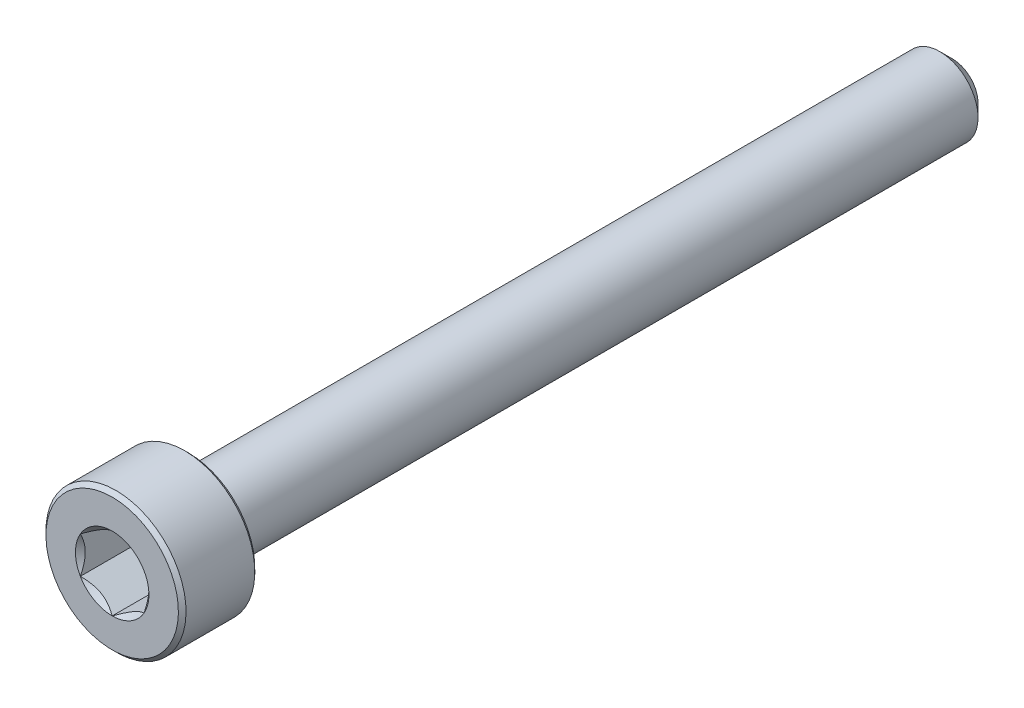
ISO-10303-21;
HEADER;
FILE_DESCRIPTION(('STEP AP214'),'2;1');
FILE_NAME('part.step','',(''),(''),'','','');
FILE_SCHEMA(('AUTOMOTIVE_DESIGN { 1 0 10303 214 1 1 1 1 }'));
ENDSEC;
DATA;
#1=APPLICATION_CONTEXT('core data for automotive mechanical design processes');
#2=APPLICATION_PROTOCOL_DEFINITION('international standard','automotive_design',2000,#1);
#3=PRODUCT_CONTEXT('',#1,'mechanical');
#4=PRODUCT('Part','Part','',(#3));
#5=PRODUCT_RELATED_PRODUCT_CATEGORY('part','',(#4));
#6=PRODUCT_DEFINITION_FORMATION('','',#4);
#7=PRODUCT_DEFINITION_CONTEXT('part definition',#1,'design');
#8=PRODUCT_DEFINITION('design','',#6,#7);
#9=PRODUCT_DEFINITION_SHAPE('','',#8);
#10=(LENGTH_UNIT() NAMED_UNIT(*) SI_UNIT(.MILLI.,.METRE.));
#11=(NAMED_UNIT(*) PLANE_ANGLE_UNIT() SI_UNIT($,.RADIAN.));
#12=(NAMED_UNIT(*) SI_UNIT($,.STERADIAN.) SOLID_ANGLE_UNIT());
#13=UNCERTAINTY_MEASURE_WITH_UNIT(LENGTH_MEASURE(1.E-05),#10,'distance_accuracy_value','');
#14=(GEOMETRIC_REPRESENTATION_CONTEXT(3) GLOBAL_UNCERTAINTY_ASSIGNED_CONTEXT((#13)) GLOBAL_UNIT_ASSIGNED_CONTEXT((#10,
#11,#12)) REPRESENTATION_CONTEXT('',''));
#15=CARTESIAN_POINT('',(0.,0.,0.));
#16=DIRECTION('',(0.,0.,1.));
#17=DIRECTION('',(1.,0.,0.));
#18=AXIS2_PLACEMENT_3D('',#15,#16,#17);
#19=CARTESIAN_POINT('',(0.,0.,16.5));
#20=DIRECTION('',(0.,0.,1.));
#21=DIRECTION('',(0.,-1.,0.));
#22=AXIS2_PLACEMENT_3D('',#19,#20,#21);
#23=PLANE('',#22);
#24=CARTESIAN_POINT('',(0.,0.,16.5));
#25=DIRECTION('',(0.,0.,1.));
#26=DIRECTION('',(1.,0.,0.));
#27=AXIS2_PLACEMENT_3D('',#24,#25,#26);
#28=CIRCLE('',#27,1.44337567297406);
#29=CARTESIAN_POINT('',(0.,-1.44337567297406,16.5));
#30=VERTEX_POINT('',#29);
#31=CARTESIAN_POINT('',(1.25,-0.721687836487031,16.5));
#32=VERTEX_POINT('',#31);
#33=EDGE_CURVE('E101',#30,#32,#28,.T.);
#34=ORIENTED_EDGE('',*,*,#33,.F.);
#35=CARTESIAN_POINT('',(-1.25,-0.721687836487032,16.5));
#36=VERTEX_POINT('',#35);
#37=EDGE_CURVE('E271',#36,#30,#28,.T.);
#38=ORIENTED_EDGE('',*,*,#37,.F.);
#39=CARTESIAN_POINT('',(-1.25,0.721687836487033,16.5));
#40=VERTEX_POINT('',#39);
#41=EDGE_CURVE('E136',#40,#36,#28,.T.);
#42=ORIENTED_EDGE('',*,*,#41,.F.);
#43=CARTESIAN_POINT('',(0.,1.44337567297406,16.5));
#44=VERTEX_POINT('',#43);
#45=EDGE_CURVE('E132',#44,#40,#28,.T.);
#46=ORIENTED_EDGE('',*,*,#45,.F.);
#47=CARTESIAN_POINT('',(1.25,0.721687836487033,16.5));
#48=VERTEX_POINT('',#47);
#49=EDGE_CURVE('E103',#48,#44,#28,.T.);
#50=ORIENTED_EDGE('',*,*,#49,.F.);
#51=EDGE_CURVE('E95',#32,#48,#28,.T.);
#52=ORIENTED_EDGE('',*,*,#51,.F.);
#53=EDGE_LOOP('',(#34,#38,#42,#46,#50,#52));
#54=FACE_BOUND('',#53,.T.);
#55=CARTESIAN_POINT('',(0.,0.,16.5));
#56=DIRECTION('',(0.,0.,-1.));
#57=DIRECTION('',(0.,1.,0.));
#58=AXIS2_PLACEMENT_3D('',#55,#56,#57);
#59=CIRCLE('',#58,2.6);
#60=CARTESIAN_POINT('',(0.,2.6,16.5));
#61=VERTEX_POINT('',#60);
#62=EDGE_CURVE('E51',#61,#61,#59,.T.);
#63=ORIENTED_EDGE('',*,*,#62,.F.);
#64=EDGE_LOOP('',(#63));
#65=FACE_BOUND('',#64,.T.);
#66=ADVANCED_FACE('F38',(#54,#65),#23,.T.);
#67=CARTESIAN_POINT('',(0.,0.,16.35));
#68=DIRECTION('',(0.,0.,-1.));
#69=DIRECTION('',(0.,1.,0.));
#70=AXIS2_PLACEMENT_3D('',#67,#68,#69);
#71=CONICAL_SURFACE('',#70,2.75,0.785398163397434);
#72=ORIENTED_EDGE('',*,*,#62,.T.);
#73=EDGE_LOOP('',(#72));
#74=FACE_BOUND('',#73,.T.);
#75=CARTESIAN_POINT('',(0.,0.,16.35));
#76=DIRECTION('',(0.,0.,-1.));
#77=DIRECTION('',(0.,1.,0.));
#78=AXIS2_PLACEMENT_3D('',#75,#76,#77);
#79=CIRCLE('',#78,2.75);
#80=CARTESIAN_POINT('',(0.,2.75,16.35));
#81=VERTEX_POINT('',#80);
#82=EDGE_CURVE('E222',#81,#81,#79,.T.);
#83=ORIENTED_EDGE('',*,*,#82,.F.);
#84=EDGE_LOOP('',(#83));
#85=FACE_BOUND('',#84,.T.);
#86=ADVANCED_FACE('F210',(#74,#85),#71,.T.);
#87=CARTESIAN_POINT('',(0.,0.,-16.5));
#88=DIRECTION('',(0.,0.,-1.));
#89=DIRECTION('',(0.,1.,0.));
#90=AXIS2_PLACEMENT_3D('',#87,#88,#89);
#91=CYLINDRICAL_SURFACE('',#90,2.75);
#92=ORIENTED_EDGE('',*,*,#82,.T.);
#93=EDGE_LOOP('',(#92));
#94=FACE_BOUND('',#93,.T.);
#95=CARTESIAN_POINT('',(0.,0.,13.65));
#96=DIRECTION('',(0.,0.,-1.));
#97=DIRECTION('',(0.,1.,0.));
#98=AXIS2_PLACEMENT_3D('',#95,#96,#97);
#99=CIRCLE('',#98,2.75);
#100=CARTESIAN_POINT('',(0.,2.75,13.65));
#101=VERTEX_POINT('',#100);
#102=EDGE_CURVE('E223',#101,#101,#99,.T.);
#103=ORIENTED_EDGE('',*,*,#102,.F.);
#104=EDGE_LOOP('',(#103));
#105=FACE_BOUND('',#104,.T.);
#106=ADVANCED_FACE('F207',(#94,#105),#91,.T.);
#107=CARTESIAN_POINT('',(0.,0.,13.5));
#108=DIRECTION('',(0.,0.,1.));
#109=DIRECTION('',(0.,-1.,0.));
#110=AXIS2_PLACEMENT_3D('',#107,#108,#109);
#111=CONICAL_SURFACE('',#110,2.6,0.785398163397445);
#112=ORIENTED_EDGE('',*,*,#102,.T.);
#113=EDGE_LOOP('',(#112));
#114=FACE_BOUND('',#113,.T.);
#115=CARTESIAN_POINT('',(0.,0.,13.5));
#116=DIRECTION('',(0.,0.,-1.));
#117=DIRECTION('',(0.,1.,0.));
#118=AXIS2_PLACEMENT_3D('',#115,#116,#117);
#119=CIRCLE('',#118,2.6);
#120=CARTESIAN_POINT('',(0.,2.6,13.5));
#121=VERTEX_POINT('',#120);
#122=EDGE_CURVE('E226',#121,#121,#119,.T.);
#123=ORIENTED_EDGE('',*,*,#122,.F.);
#124=EDGE_LOOP('',(#123));
#125=FACE_BOUND('',#124,.T.);
#126=ADVANCED_FACE('F203',(#114,#125),#111,.T.);
#127=CARTESIAN_POINT('',(0.,2.6,13.5));
#128=DIRECTION('',(0.,0.,-1.));
#129=DIRECTION('',(0.,1.,0.));
#130=AXIS2_PLACEMENT_3D('',#127,#128,#129);
#131=PLANE('',#130);
#132=ORIENTED_EDGE('',*,*,#122,.T.);
#133=EDGE_LOOP('',(#132));
#134=FACE_BOUND('',#133,.T.);
#135=CARTESIAN_POINT('',(0.,0.,13.5));
#136=DIRECTION('',(0.,0.,-1.));
#137=DIRECTION('',(0.,1.,0.));
#138=AXIS2_PLACEMENT_3D('',#135,#136,#137);
#139=CIRCLE('',#138,1.5);
#140=CARTESIAN_POINT('',(0.,1.5,13.5));
#141=VERTEX_POINT('',#140);
#142=EDGE_CURVE('E231',#141,#141,#139,.T.);
#143=ORIENTED_EDGE('',*,*,#142,.F.);
#144=EDGE_LOOP('',(#143));
#145=FACE_BOUND('',#144,.T.);
#146=ADVANCED_FACE('F199',(#134,#145),#131,.T.);
#147=CARTESIAN_POINT('',(0.,0.,-16.5));
#148=DIRECTION('',(0.,0.,-1.));
#149=DIRECTION('',(0.,1.,0.));
#150=AXIS2_PLACEMENT_3D('',#147,#148,#149);
#151=CYLINDRICAL_SURFACE('',#150,1.5);
#152=ORIENTED_EDGE('',*,*,#142,.T.);
#153=EDGE_LOOP('',(#152));
#154=FACE_BOUND('',#153,.T.);
#155=CARTESIAN_POINT('',(0.,0.,-16.));
#156=DIRECTION('',(0.,0.,-1.));
#157=DIRECTION('',(0.,1.,0.));
#158=AXIS2_PLACEMENT_3D('',#155,#156,#157);
#159=CIRCLE('',#158,1.5);
#160=CARTESIAN_POINT('',(0.,1.5,-16.));
#161=VERTEX_POINT('',#160);
#162=EDGE_CURVE('E234',#161,#161,#159,.T.);
#163=ORIENTED_EDGE('',*,*,#162,.F.);
#164=EDGE_LOOP('',(#163));
#165=FACE_BOUND('',#164,.T.);
#166=ADVANCED_FACE('F195',(#154,#165),#151,.T.);
#167=CARTESIAN_POINT('',(0.,0.,-16.5));
#168=DIRECTION('',(0.,0.,1.));
#169=DIRECTION('',(0.,-1.,0.));
#170=AXIS2_PLACEMENT_3D('',#167,#168,#169);
#171=CONICAL_SURFACE('',#170,1.,0.785398163397441);
#172=ORIENTED_EDGE('',*,*,#162,.T.);
#173=EDGE_LOOP('',(#172));
#174=FACE_BOUND('',#173,.T.);
#175=CARTESIAN_POINT('',(0.,0.,-16.5));
#176=DIRECTION('',(0.,0.,-1.));
#177=DIRECTION('',(0.,1.,0.));
#178=AXIS2_PLACEMENT_3D('',#175,#176,#177);
#179=CIRCLE('',#178,1.);
#180=CARTESIAN_POINT('',(0.,1.,-16.5));
#181=VERTEX_POINT('',#180);
#182=EDGE_CURVE('E237',#181,#181,#179,.T.);
#183=ORIENTED_EDGE('',*,*,#182,.F.);
#184=EDGE_LOOP('',(#183));
#185=FACE_BOUND('',#184,.T.);
#186=ADVANCED_FACE('F191',(#174,#185),#171,.T.);
#187=CARTESIAN_POINT('',(0.,1.,-16.5));
#188=DIRECTION('',(0.,0.,-1.));
#189=DIRECTION('',(0.,1.,0.));
#190=AXIS2_PLACEMENT_3D('',#187,#188,#189);
#191=PLANE('',#190);
#192=ORIENTED_EDGE('',*,*,#182,.T.);
#193=EDGE_LOOP('',(#192));
#194=FACE_BOUND('',#193,.T.);
#195=ADVANCED_FACE('F188',(#194),#191,.T.);
#196=CARTESIAN_POINT('',(0.,0.,16.5));
#197=DIRECTION('',(0.,0.,1.));
#198=DIRECTION('',(1.,0.,0.));
#199=AXIS2_PLACEMENT_3D('',#196,#197,#198);
#200=CONICAL_SURFACE('',#199,1.44337567297406,0.78539816339745);
#201=ORIENTED_EDGE('',*,*,#33,.T.);
#202=CARTESIAN_POINT('',(-0.000200000000000081,-1.4434911430279,16.5001154839091));
#203=CARTESIAN_POINT('',(0.0427751670715865,-1.41867941875065,16.4753216680551));
#204=CARTESIAN_POINT('',(0.0864690047459475,-1.39345276980743,16.4519837344187));
#205=CARTESIAN_POINT('',(0.175565930841941,-1.34201263554194,16.4092520040845));
#206=CARTESIAN_POINT('',(0.220977498357063,-1.31579425481276,16.3898819923604));
#207=CARTESIAN_POINT('',(0.312547820935259,-1.26292610442246,16.3567004834135));
#208=CARTESIAN_POINT('',(0.358683240175884,-1.23628980770471,16.3428055590527));
#209=CARTESIAN_POINT('',(0.45197008040759,-1.18243062538508,16.3213972821606));
#210=CARTESIAN_POINT('',(0.499118649136377,-1.15520938653761,16.3138679415668));
#211=CARTESIAN_POINT('',(0.580373556887249,-1.10829684367467,16.3070744980507));
#212=CARTESIAN_POINT('',(0.614374876627938,-1.08866617256958,16.3060685591044));
#213=CARTESIAN_POINT('',(0.682317764432474,-1.04943932800611,16.3077614149113));
#214=CARTESIAN_POINT('',(0.716259317655654,-1.02984316311599,16.3104610272155));
#215=CARTESIAN_POINT('',(0.783814856457496,-0.990839954603501,16.3194089303164));
#216=CARTESIAN_POINT('',(0.817428507286772,-0.971433104248772,16.3256605258997));
#217=CARTESIAN_POINT('',(0.88409463821781,-0.932943395609907,16.3413756814139));
#218=CARTESIAN_POINT('',(0.917146871030292,-0.913860680098302,16.3508406200875));
#219=CARTESIAN_POINT('',(1.00179969160026,-0.864986351354569,16.3789313906876));
#220=CARTESIAN_POINT('',(1.05286649242963,-0.835502920149077,16.3996701574522));
#221=CARTESIAN_POINT('',(1.15300085411325,-0.777690319475909,16.4463871346715));
#222=CARTESIAN_POINT('',(1.20207431157827,-0.749357745598417,16.4723482959468));
#223=CARTESIAN_POINT('',(1.2502,-0.721572366433194,16.5001154839091));
#224=B_SPLINE_CURVE_WITH_KNOTS('',3,(#202,#203,#204,#205,#206,#207,#208,#209,#210,#211,#212,
#213,#214,#215,#216,#217,#218,#219,#220,#221,#222,#223),.UNSPECIFIED.,.F.,.F.,(4,2,2,2,2,2,2,2,
2,2,4),(0.,0.166533409618303,0.334037607289762,0.498880396489697,0.663307919240272,
0.780963963458824,0.89864597014845,1.01643764860773,1.13427993171549,1.3214865203214,
1.50809158792573),.UNSPECIFIED.);
#225=EDGE_CURVE('E12',#30,#32,#224,.T.);
#226=ORIENTED_EDGE('',*,*,#225,.F.);
#227=EDGE_LOOP('',(#201,#226));
#228=FACE_BOUND('',#227,.T.);
#229=ADVANCED_FACE('F154',(#228),#200,.F.);
#230=ORIENTED_EDGE('',*,*,#37,.T.);
#231=CARTESIAN_POINT('',(-1.2502,-0.721572366433194,16.5001154839091));
#232=CARTESIAN_POINT('',(-1.20722483292841,-0.746384090710444,16.4753216680551));
#233=CARTESIAN_POINT('',(-1.16353099525405,-0.771610739653664,16.4519837344187));
#234=CARTESIAN_POINT('',(-1.07443406915806,-0.823050873919153,16.4092520040845));
#235=CARTESIAN_POINT('',(-1.02902250164294,-0.849269254648332,16.3898819923604));
#236=CARTESIAN_POINT('',(-0.937452179064743,-0.902137405038634,16.3567004834135));
#237=CARTESIAN_POINT('',(-0.891316759824117,-0.928773701756385,16.3428055590527));
#238=CARTESIAN_POINT('',(-0.79802991959241,-0.982632884076011,16.3213972821606));
#239=CARTESIAN_POINT('',(-0.750881350863623,-1.00985412292348,16.3138679415668));
#240=CARTESIAN_POINT('',(-0.669626443112751,-1.05676666578643,16.3070744980507));
#241=CARTESIAN_POINT('',(-0.635625123372062,-1.07639733689151,16.3060685591044));
#242=CARTESIAN_POINT('',(-0.567682235567526,-1.11562418145498,16.3077614149113));
#243=CARTESIAN_POINT('',(-0.533740682344346,-1.1352203463451,16.3104610272155));
#244=CARTESIAN_POINT('',(-0.466185143542504,-1.1742235548576,16.3194089303164));
#245=CARTESIAN_POINT('',(-0.432571492713229,-1.19363040521232,16.3256605258997));
#246=CARTESIAN_POINT('',(-0.365905361782191,-1.23212011385119,16.3413756814139));
#247=CARTESIAN_POINT('',(-0.332853128969708,-1.25120282936279,16.3508406200875));
#248=CARTESIAN_POINT('',(-0.248200308399738,-1.30007715810653,16.3789313906876));
#249=CARTESIAN_POINT('',(-0.197133507570364,-1.32956058931202,16.3996701574522));
#250=CARTESIAN_POINT('',(-0.0969991458867461,-1.38737318998519,16.4463871346715));
#251=CARTESIAN_POINT('',(-0.0479256884217307,-1.41570576386268,16.4723482959468));
#252=CARTESIAN_POINT('',(0.000200000000001012,-1.4434911430279,16.5001154839091));
#253=B_SPLINE_CURVE_WITH_KNOTS('',3,(#231,#232,#233,#234,#235,#236,#237,#238,#239,#240,#241,
#242,#243,#244,#245,#246,#247,#248,#249,#250,#251,#252),.UNSPECIFIED.,.F.,.F.,(4,2,2,2,2,2,2,2,
2,2,4),(0.,0.166533409618302,0.334037607289759,0.498880396489696,0.663307919240271,
0.780963963458824,0.898645970148449,1.01643764860773,1.13427993171549,1.32148652032141,
1.50809158792574),.UNSPECIFIED.);
#254=EDGE_CURVE('E133',#36,#30,#253,.T.);
#255=ORIENTED_EDGE('',*,*,#254,.F.);
#256=EDGE_LOOP('',(#230,#255));
#257=FACE_BOUND('',#256,.T.);
#258=ADVANCED_FACE('F269',(#257),#200,.F.);
#259=ORIENTED_EDGE('',*,*,#41,.T.);
#260=CARTESIAN_POINT('',(-1.25,-1.43934010808077,16.9629820968923));
#261=CARTESIAN_POINT('',(-1.25,-1.40429313005659,16.9365249226329));
#262=CARTESIAN_POINT('',(-1.25,-1.36905087135599,16.9103271603543));
#263=CARTESIAN_POINT('',(-1.25,-1.29809650706311,16.8585575718396));
#264=CARTESIAN_POINT('',(-1.25,-1.26238428576496,16.8329859043563));
#265=CARTESIAN_POINT('',(-1.25,-1.15390111792708,16.7570059936895));
#266=CARTESIAN_POINT('',(-1.25,-1.08031646726265,16.7077402861896));
#267=CARTESIAN_POINT('',(-1.25,-0.926012322755098,16.6110258302631));
#268=CARTESIAN_POINT('',(-1.25,-0.845125318656149,16.5638412989418));
#269=CARTESIAN_POINT('',(-1.25,-0.679311174076605,16.4775307343904));
#270=CARTESIAN_POINT('',(-1.25,-0.594398891026689,16.4383775346269));
#271=CARTESIAN_POINT('',(-1.25,-0.466944812460742,16.3904772236883));
#272=CARTESIAN_POINT('',(-1.25,-0.426289985812823,16.3767294897863));
#273=CARTESIAN_POINT('',(-1.25,-0.343998850091269,16.3524979274505));
#274=CARTESIAN_POINT('',(-1.25,-0.302362473614963,16.3420143238698));
#275=CARTESIAN_POINT('',(-1.25,-0.219052696285666,16.3250301617483));
#276=CARTESIAN_POINT('',(-1.25,-0.1773934284745,16.3184613604714));
#277=CARTESIAN_POINT('',(-1.25,-0.0936293693401925,16.3094350534578));
#278=CARTESIAN_POINT('',(-1.25,-0.0515246558543964,16.3069768409973));
#279=CARTESIAN_POINT('',(-1.25,0.0311890576306315,16.3063540620133));
#280=CARTESIAN_POINT('',(-1.25,0.0717969625499306,16.3080371168463));
#281=CARTESIAN_POINT('',(-1.25,0.152668636885198,16.3152682705979));
#282=CARTESIAN_POINT('',(-1.25,0.192932338835359,16.3208171104131));
#283=CARTESIAN_POINT('',(-1.25,0.273499879165296,16.335571036465));
#284=CARTESIAN_POINT('',(-1.25,0.313792180618512,16.3448381759641));
#285=CARTESIAN_POINT('',(-1.25,0.393496413911458,16.3665361784573));
#286=CARTESIAN_POINT('',(-1.25,0.432908419115059,16.3789667767306));
#287=CARTESIAN_POINT('',(-1.25,0.556992735862299,16.4227793529314));
#288=CARTESIAN_POINT('',(-1.25,0.639898924666086,16.459151072876));
#289=CARTESIAN_POINT('',(-1.25,0.801816555499701,16.5400191621783));
#290=CARTESIAN_POINT('',(-1.25,0.880812666325045,16.584544720912));
#291=CARTESIAN_POINT('',(-1.25,1.0317856127975,16.6764048766666));
#292=CARTESIAN_POINT('',(-1.25,1.10391618485086,16.7234899339163));
#293=CARTESIAN_POINT('',(-1.25,1.2101860604331,16.7962785615985));
#294=CARTESIAN_POINT('',(-1.25,1.24515069969379,16.8207980853934));
#295=CARTESIAN_POINT('',(-1.25,1.31460220852736,16.8704856367657));
#296=CARTESIAN_POINT('',(-1.25,1.34908920596618,16.8956534854155));
#297=CARTESIAN_POINT('',(-1.25,1.38337731682912,16.9210901488412));
#298=B_SPLINE_CURVE_WITH_KNOTS('',3,(#260,#261,#262,#263,#264,#265,#266,#267,#268,#269,#270,
#271,#272,#273,#274,#275,#276,#277,#278,#279,#280,#281,#282,#283,#284,#285,#286,#287,#288,#289,
#290,#291,#292,#293,#294,#295,#296,#297),.UNSPECIFIED.,.F.,.F.,(4,2,2,2,2,2,2,2,2,2,2,2,2,2,2,2,
2,2,4),(0.,0.131732960381449,0.263498984161644,0.529042014455825,0.809741926134618,
1.08947609717225,1.21811634272577,1.34676544783901,1.47310084517844,1.59941451973785,
1.7211504216785,1.84290966131735,1.96679153905342,2.09066305366039,2.36146692896009,
2.63325989198491,2.89154668212279,3.01965734507713,3.14773302245628),.UNSPECIFIED.);
#299=EDGE_CURVE('E134',#40,#36,#298,.F.);
#300=ORIENTED_EDGE('',*,*,#299,.F.);
#301=EDGE_LOOP('',(#259,#300));
#302=FACE_BOUND('',#301,.T.);
#303=ADVANCED_FACE('F274',(#302),#200,.F.);
#304=ORIENTED_EDGE('',*,*,#45,.T.);
#305=CARTESIAN_POINT('',(0.000199999999999872,1.4434911430279,16.5001154839091));
#306=CARTESIAN_POINT('',(-0.0427751670715865,1.41867941875065,16.4753216680551));
#307=CARTESIAN_POINT('',(-0.0864690047459473,1.39345276980743,16.4519837344187));
#308=CARTESIAN_POINT('',(-0.17556593084194,1.34201263554194,16.4092520040845));
#309=CARTESIAN_POINT('',(-0.220977498357062,1.31579425481276,16.3898819923604));
#310=CARTESIAN_POINT('',(-0.312547820935258,1.26292610442246,16.3567004834135));
#311=CARTESIAN_POINT('',(-0.358683240175883,1.23628980770471,16.3428055590527));
#312=CARTESIAN_POINT('',(-0.45197008040759,1.18243062538509,16.3213972821606));
#313=CARTESIAN_POINT('',(-0.499118649136377,1.15520938653761,16.3138679415668));
#314=CARTESIAN_POINT('',(-0.58037355688725,1.10829684367467,16.3070744980507));
#315=CARTESIAN_POINT('',(-0.614374876627938,1.08866617256958,16.3060685591044));
#316=CARTESIAN_POINT('',(-0.682317764432475,1.04943932800611,16.3077614149113));
#317=CARTESIAN_POINT('',(-0.716259317655655,1.02984316311599,16.3104610272155));
#318=CARTESIAN_POINT('',(-0.783814856457497,0.9908399546035,16.3194089303164));
#319=CARTESIAN_POINT('',(-0.817428507286773,0.971433104248772,16.3256605258997));
#320=CARTESIAN_POINT('',(-0.884094638217811,0.932943395609906,16.3413756814139));
#321=CARTESIAN_POINT('',(-0.917146871030293,0.913860680098302,16.3508406200875));
#322=CARTESIAN_POINT('',(-1.00179969160026,0.864986351354569,16.3789313906876));
#323=CARTESIAN_POINT('',(-1.05286649242964,0.835502920149077,16.3996701574522));
#324=CARTESIAN_POINT('',(-1.15300085411325,0.777690319475909,16.4463871346715));
#325=CARTESIAN_POINT('',(-1.20207431157827,0.749357745598417,16.4723482959468));
#326=CARTESIAN_POINT('',(-1.2502,0.721572366433194,16.5001154839091));
#327=B_SPLINE_CURVE_WITH_KNOTS('',3,(#305,#306,#307,#308,#309,#310,#311,#312,#313,#314,#315,
#316,#317,#318,#319,#320,#321,#322,#323,#324,#325,#326),.UNSPECIFIED.,.F.,.F.,(4,2,2,2,2,2,2,2,
2,2,4),(0.,0.166533409618302,0.33403760728976,0.498880396489696,0.663307919240272,
0.780963963458824,0.89864597014845,1.01643764860773,1.13427993171549,1.32148652032141,
1.50809158792574),.UNSPECIFIED.);
#328=EDGE_CURVE('E113',#44,#40,#327,.T.);
#329=ORIENTED_EDGE('',*,*,#328,.F.);
#330=EDGE_LOOP('',(#304,#329));
#331=FACE_BOUND('',#330,.T.);
#332=ADVANCED_FACE('F308',(#331),#200,.F.);
#333=ORIENTED_EDGE('',*,*,#49,.T.);
#334=CARTESIAN_POINT('',(1.2502,0.721572366433195,16.5001154839091));
#335=CARTESIAN_POINT('',(1.20722483292841,0.746384090710444,16.4753216680551));
#336=CARTESIAN_POINT('',(1.16353099525405,0.771610739653664,16.4519837344187));
#337=CARTESIAN_POINT('',(1.07443406915806,0.823050873919154,16.4092520040845));
#338=CARTESIAN_POINT('',(1.02902250164294,0.849269254648332,16.3898819923604));
#339=CARTESIAN_POINT('',(0.937452179064743,0.902137405038634,16.3567004834135));
#340=CARTESIAN_POINT('',(0.891316759824118,0.928773701756385,16.3428055590527));
#341=CARTESIAN_POINT('',(0.798029919592411,0.982632884076011,16.3213972821606));
#342=CARTESIAN_POINT('',(0.750881350863624,1.00985412292348,16.3138679415668));
#343=CARTESIAN_POINT('',(0.669626443112752,1.05676666578643,16.3070744980507));
#344=CARTESIAN_POINT('',(0.635625123372064,1.07639733689151,16.3060685591044));
#345=CARTESIAN_POINT('',(0.567682235567527,1.11562418145498,16.3077614149113));
#346=CARTESIAN_POINT('',(0.533740682344347,1.1352203463451,16.3104610272155));
#347=CARTESIAN_POINT('',(0.466185143542505,1.17422355485759,16.3194089303164));
#348=CARTESIAN_POINT('',(0.43257149271323,1.19363040521232,16.3256605258997));
#349=CARTESIAN_POINT('',(0.365905361782192,1.23212011385119,16.3413756814139));
#350=CARTESIAN_POINT('',(0.332853128969709,1.25120282936279,16.3508406200875));
#351=CARTESIAN_POINT('',(0.248200308399739,1.30007715810653,16.3789313906876));
#352=CARTESIAN_POINT('',(0.197133507570365,1.32956058931202,16.3996701574522));
#353=CARTESIAN_POINT('',(0.0969991458867464,1.38737318998519,16.4463871346715));
#354=CARTESIAN_POINT('',(0.0479256884217309,1.41570576386268,16.4723482959468));
#355=CARTESIAN_POINT('',(-0.000200000000001121,1.4434911430279,16.5001154839091));
#356=B_SPLINE_CURVE_WITH_KNOTS('',3,(#334,#335,#336,#337,#338,#339,#340,#341,#342,#343,#344,
#345,#346,#347,#348,#349,#350,#351,#352,#353,#354,#355),.UNSPECIFIED.,.F.,.F.,(4,2,2,2,2,2,2,2,
2,2,4),(0.,0.166533409618302,0.334037607289759,0.498880396489694,0.66330791924027,
0.780963963458821,0.898645970148448,1.01643764860773,1.13427993171549,1.32148652032141,
1.50809158792574),.UNSPECIFIED.);
#357=EDGE_CURVE('E106',#48,#44,#356,.T.);
#358=ORIENTED_EDGE('',*,*,#357,.F.);
#359=EDGE_LOOP('',(#333,#358));
#360=FACE_BOUND('',#359,.T.);
#361=ADVANCED_FACE('F107',(#360),#200,.F.);
#362=ORIENTED_EDGE('',*,*,#51,.T.);
#363=CARTESIAN_POINT('',(1.25,-1.43934010808077,16.9629820968923));
#364=CARTESIAN_POINT('',(1.25,-1.40429313005658,16.9365249226329));
#365=CARTESIAN_POINT('',(1.25,-1.36905087135599,16.9103271603543));
#366=CARTESIAN_POINT('',(1.25,-1.29809650706311,16.8585575718396));
#367=CARTESIAN_POINT('',(1.25,-1.26238428576495,16.8329859043563));
#368=CARTESIAN_POINT('',(1.25,-1.15390111792708,16.7570059936895));
#369=CARTESIAN_POINT('',(1.25,-1.08031646726264,16.7077402861896));
#370=CARTESIAN_POINT('',(1.25,-0.926012322755093,16.6110258302631));
#371=CARTESIAN_POINT('',(1.25,-0.845125318656144,16.5638412989418));
#372=CARTESIAN_POINT('',(1.25,-0.6793111740766,16.4775307343904));
#373=CARTESIAN_POINT('',(1.25,-0.594398891026686,16.4383775346269));
#374=CARTESIAN_POINT('',(1.25,-0.466944812460738,16.3904772236883));
#375=CARTESIAN_POINT('',(1.25,-0.426289985812819,16.3767294897863));
#376=CARTESIAN_POINT('',(1.25,-0.343998850091265,16.3524979274505));
#377=CARTESIAN_POINT('',(1.25,-0.30236247361496,16.3420143238698));
#378=CARTESIAN_POINT('',(1.25,-0.219052696285664,16.3250301617483));
#379=CARTESIAN_POINT('',(1.25,-0.177393428474498,16.3184613604714));
#380=CARTESIAN_POINT('',(1.25,-0.0936293693401904,16.3094350534578));
#381=CARTESIAN_POINT('',(1.25,-0.0515246558543945,16.3069768409973));
#382=CARTESIAN_POINT('',(1.25,0.0311890576306332,16.3063540620133));
#383=CARTESIAN_POINT('',(1.25,0.0717969625499323,16.3080371168463));
#384=CARTESIAN_POINT('',(1.25,0.152668636885199,16.3152682705979));
#385=CARTESIAN_POINT('',(1.25,0.19293233883536,16.3208171104131));
#386=CARTESIAN_POINT('',(1.25,0.273499879165297,16.335571036465));
#387=CARTESIAN_POINT('',(1.25,0.313792180618513,16.3448381759641));
#388=CARTESIAN_POINT('',(1.25,0.393496413911459,16.3665361784573));
#389=CARTESIAN_POINT('',(1.25,0.43290841911506,16.3789667767306));
#390=CARTESIAN_POINT('',(1.25,0.5569927358623,16.4227793529314));
#391=CARTESIAN_POINT('',(1.25,0.639898924666087,16.459151072876));
#392=CARTESIAN_POINT('',(1.25,0.801816555499704,16.5400191621783));
#393=CARTESIAN_POINT('',(1.25,0.880812666325047,16.584544720912));
#394=CARTESIAN_POINT('',(1.25,1.0317856127975,16.6764048766666));
#395=CARTESIAN_POINT('',(1.25,1.10391618485086,16.7234899339163));
#396=CARTESIAN_POINT('',(1.25,1.21018606043311,16.7962785615985));
#397=CARTESIAN_POINT('',(1.25,1.2451506996938,16.8207980853934));
#398=CARTESIAN_POINT('',(1.25,1.31460220852737,16.8704856367657));
#399=CARTESIAN_POINT('',(1.25,1.34908920596618,16.8956534854155));
#400=CARTESIAN_POINT('',(1.25,1.38337731682912,16.9210901488412));
#401=B_SPLINE_CURVE_WITH_KNOTS('',3,(#363,#364,#365,#366,#367,#368,#369,#370,#371,#372,#373,
#374,#375,#376,#377,#378,#379,#380,#381,#382,#383,#384,#385,#386,#387,#388,#389,#390,#391,#392,
#393,#394,#395,#396,#397,#398,#399,#400),.UNSPECIFIED.,.F.,.F.,(4,2,2,2,2,2,2,2,2,2,2,2,2,2,2,2,
2,2,4),(0.,0.131732960381447,0.263498984161644,0.529042014455823,0.809741926134617,
1.08947609717225,1.21811634272576,1.346765447839,1.47310084517844,1.59941451973784,
1.72115042167849,1.84290966131735,1.96679153905341,2.09066305366039,2.36146692896009,
2.63325989198491,2.89154668212279,3.01965734507713,3.14773302245628),.UNSPECIFIED.);
#402=EDGE_CURVE('E57',#32,#48,#401,.T.);
#403=ORIENTED_EDGE('',*,*,#402,.F.);
#404=EDGE_LOOP('',(#362,#403));
#405=FACE_BOUND('',#404,.T.);
#406=ADVANCED_FACE('F97',(#405),#200,.F.);
#407=CARTESIAN_POINT('',(0.,2.6,14.5));
#408=DIRECTION('',(0.,0.,-1.));
#409=DIRECTION('',(0.,1.,0.));
#410=AXIS2_PLACEMENT_3D('',#407,#408,#409);
#411=PLANE('',#410);
#412=DIRECTION('',(0.866025403784438,0.5,0.));
#413=VECTOR('',#412,1.);
#414=CARTESIAN_POINT('',(0.,-1.44337567297406,14.5));
#415=LINE('',#414,#413);
#416=CARTESIAN_POINT('',(0.,-1.44337567297406,14.5));
#417=VERTEX_POINT('',#416);
#418=CARTESIAN_POINT('',(1.25,-0.721687836487032,14.5));
#419=VERTEX_POINT('',#418);
#420=EDGE_CURVE('E240',#417,#419,#415,.T.);
#421=ORIENTED_EDGE('',*,*,#420,.T.);
#422=DIRECTION('',(0.,1.,0.));
#423=VECTOR('',#422,1.);
#424=CARTESIAN_POINT('',(1.25,-0.721687836487032,14.5));
#425=LINE('',#424,#423);
#426=CARTESIAN_POINT('',(1.25,0.721687836487032,14.5));
#427=VERTEX_POINT('',#426);
#428=EDGE_CURVE('E123',#419,#427,#425,.T.);
#429=ORIENTED_EDGE('',*,*,#428,.T.);
#430=DIRECTION('',(-0.866025403784439,0.5,0.));
#431=VECTOR('',#430,1.);
#432=CARTESIAN_POINT('',(1.25,0.721687836487032,14.5));
#433=LINE('',#432,#431);
#434=CARTESIAN_POINT('',(0.,1.44337567297406,14.5));
#435=VERTEX_POINT('',#434);
#436=EDGE_CURVE('E127',#427,#435,#433,.T.);
#437=ORIENTED_EDGE('',*,*,#436,.T.);
#438=DIRECTION('',(-0.866025403784438,-0.5,0.));
#439=VECTOR('',#438,1.);
#440=CARTESIAN_POINT('',(0.,1.44337567297406,14.5));
#441=LINE('',#440,#439);
#442=CARTESIAN_POINT('',(-1.25,0.721687836487032,14.5));
#443=VERTEX_POINT('',#442);
#444=EDGE_CURVE('E244',#435,#443,#441,.T.);
#445=ORIENTED_EDGE('',*,*,#444,.T.);
#446=DIRECTION('',(0.,-1.,0.));
#447=VECTOR('',#446,1.);
#448=CARTESIAN_POINT('',(-1.25,0.721687836487032,14.5));
#449=LINE('',#448,#447);
#450=CARTESIAN_POINT('',(-1.25,-0.721687836487032,14.5));
#451=VERTEX_POINT('',#450);
#452=EDGE_CURVE('E248',#443,#451,#449,.T.);
#453=ORIENTED_EDGE('',*,*,#452,.T.);
#454=DIRECTION('',(0.866025403784439,-0.5,0.));
#455=VECTOR('',#454,1.);
#456=CARTESIAN_POINT('',(-1.25,-0.721687836487032,14.5));
#457=LINE('',#456,#455);
#458=EDGE_CURVE('E250',#451,#417,#457,.T.);
#459=ORIENTED_EDGE('',*,*,#458,.T.);
#460=EDGE_LOOP('',(#421,#429,#437,#445,#453,#459));
#461=FACE_BOUND('',#460,.T.);
#462=ADVANCED_FACE('F153',(#461),#411,.F.);
#463=CARTESIAN_POINT('',(0.,-1.44337567297406,9.68118692087013));
#464=DIRECTION('',(0.5,-0.866025403784438,0.));
#465=DIRECTION('',(0.866025403784438,0.5,0.));
#466=AXIS2_PLACEMENT_3D('',#463,#464,#465);
#467=PLANE('',#466);
#468=DIRECTION('',(0.,0.,1.));
#469=VECTOR('',#468,1.);
#470=CARTESIAN_POINT('',(0.,-1.44337567297406,9.68118692087013));
#471=LINE('',#470,#469);
#472=EDGE_CURVE('E251',#417,#30,#471,.T.);
#473=ORIENTED_EDGE('',*,*,#472,.T.);
#474=ORIENTED_EDGE('',*,*,#225,.T.);
#475=DIRECTION('',(0.,0.,1.));
#476=VECTOR('',#475,1.);
#477=CARTESIAN_POINT('',(1.25,-0.721687836487032,9.68118692087013));
#478=LINE('',#477,#476);
#479=EDGE_CURVE('E122',#419,#32,#478,.T.);
#480=ORIENTED_EDGE('',*,*,#479,.F.);
#481=ORIENTED_EDGE('',*,*,#420,.F.);
#482=EDGE_LOOP('',(#473,#474,#480,#481));
#483=FACE_BOUND('',#482,.T.);
#484=ADVANCED_FACE('F155',(#483),#467,.F.);
#485=CARTESIAN_POINT('',(-1.25,-0.721687836487032,9.68118692087013));
#486=DIRECTION('',(-0.5,-0.866025403784439,0.));
#487=DIRECTION('',(0.866025403784439,-0.5,0.));
#488=AXIS2_PLACEMENT_3D('',#485,#486,#487);
#489=PLANE('',#488);
#490=DIRECTION('',(0.,0.,1.));
#491=VECTOR('',#490,1.);
#492=CARTESIAN_POINT('',(-1.25,-0.721687836487032,9.68118692087013));
#493=LINE('',#492,#491);
#494=EDGE_CURVE('E65',#451,#36,#493,.T.);
#495=ORIENTED_EDGE('',*,*,#494,.T.);
#496=ORIENTED_EDGE('',*,*,#254,.T.);
#497=ORIENTED_EDGE('',*,*,#472,.F.);
#498=ORIENTED_EDGE('',*,*,#458,.F.);
#499=EDGE_LOOP('',(#495,#496,#497,#498));
#500=FACE_BOUND('',#499,.T.);
#501=ADVANCED_FACE('F149',(#500),#489,.F.);
#502=CARTESIAN_POINT('',(-1.25,0.721687836487032,9.68118692087013));
#503=DIRECTION('',(-1.,0.,0.));
#504=DIRECTION('',(0.,0.,1.));
#505=AXIS2_PLACEMENT_3D('',#502,#503,#504);
#506=PLANE('',#505);
#507=DIRECTION('',(0.,0.,1.));
#508=VECTOR('',#507,1.);
#509=CARTESIAN_POINT('',(-1.25,0.721687836487032,9.68118692087013));
#510=LINE('',#509,#508);
#511=EDGE_CURVE('E245',#443,#40,#510,.T.);
#512=ORIENTED_EDGE('',*,*,#511,.T.);
#513=ORIENTED_EDGE('',*,*,#299,.T.);
#514=ORIENTED_EDGE('',*,*,#494,.F.);
#515=ORIENTED_EDGE('',*,*,#452,.F.);
#516=EDGE_LOOP('',(#512,#513,#514,#515));
#517=FACE_BOUND('',#516,.T.);
#518=ADVANCED_FACE('F280',(#517),#506,.F.);
#519=CARTESIAN_POINT('',(0.,1.44337567297406,9.68118692087013));
#520=DIRECTION('',(-0.5,0.866025403784438,0.));
#521=DIRECTION('',(-0.866025403784438,-0.5,0.));
#522=AXIS2_PLACEMENT_3D('',#519,#520,#521);
#523=PLANE('',#522);
#524=DIRECTION('',(0.,0.,1.));
#525=VECTOR('',#524,1.);
#526=CARTESIAN_POINT('',(0.,1.44337567297406,9.68118692087013));
#527=LINE('',#526,#525);
#528=EDGE_CURVE('E242',#435,#44,#527,.T.);
#529=ORIENTED_EDGE('',*,*,#528,.T.);
#530=ORIENTED_EDGE('',*,*,#328,.T.);
#531=ORIENTED_EDGE('',*,*,#511,.F.);
#532=ORIENTED_EDGE('',*,*,#444,.F.);
#533=EDGE_LOOP('',(#529,#530,#531,#532));
#534=FACE_BOUND('',#533,.T.);
#535=ADVANCED_FACE('F180',(#534),#523,.F.);
#536=CARTESIAN_POINT('',(1.25,0.721687836487032,9.68118692087013));
#537=DIRECTION('',(0.5,0.866025403784439,0.));
#538=DIRECTION('',(-0.866025403784439,0.5,0.));
#539=AXIS2_PLACEMENT_3D('',#536,#537,#538);
#540=PLANE('',#539);
#541=DIRECTION('',(0.,0.,1.));
#542=VECTOR('',#541,1.);
#543=CARTESIAN_POINT('',(1.25,0.721687836487032,9.68118692087013));
#544=LINE('',#543,#542);
#545=EDGE_CURVE('E119',#427,#48,#544,.T.);
#546=ORIENTED_EDGE('',*,*,#545,.T.);
#547=ORIENTED_EDGE('',*,*,#357,.T.);
#548=ORIENTED_EDGE('',*,*,#528,.F.);
#549=ORIENTED_EDGE('',*,*,#436,.F.);
#550=EDGE_LOOP('',(#546,#547,#548,#549));
#551=FACE_BOUND('',#550,.T.);
#552=ADVANCED_FACE('F125',(#551),#540,.F.);
#553=CARTESIAN_POINT('',(1.25,-0.721687836487032,9.68118692087013));
#554=DIRECTION('',(1.,0.,0.));
#555=DIRECTION('',(0.,1.,0.));
#556=AXIS2_PLACEMENT_3D('',#553,#554,#555);
#557=PLANE('',#556);
#558=ORIENTED_EDGE('',*,*,#479,.T.);
#559=ORIENTED_EDGE('',*,*,#402,.T.);
#560=ORIENTED_EDGE('',*,*,#545,.F.);
#561=ORIENTED_EDGE('',*,*,#428,.F.);
#562=EDGE_LOOP('',(#558,#559,#560,#561));
#563=FACE_BOUND('',#562,.T.);
#564=ADVANCED_FACE('F118',(#563),#557,.F.);
#565=CLOSED_SHELL('',(#66,#86,#106,#126,#146,#166,#186,#195,#229,#258,#303,#332,#361,#406,#462,
#484,#501,#518,#535,#552,#564));
#566=MANIFOLD_SOLID_BREP('B2',#565);
#567=ADVANCED_BREP_SHAPE_REPRESENTATION('',(#18,#566),#14);
#568=SHAPE_DEFINITION_REPRESENTATION(#9,#567);
ENDSEC;
END-ISO-10303-21;
